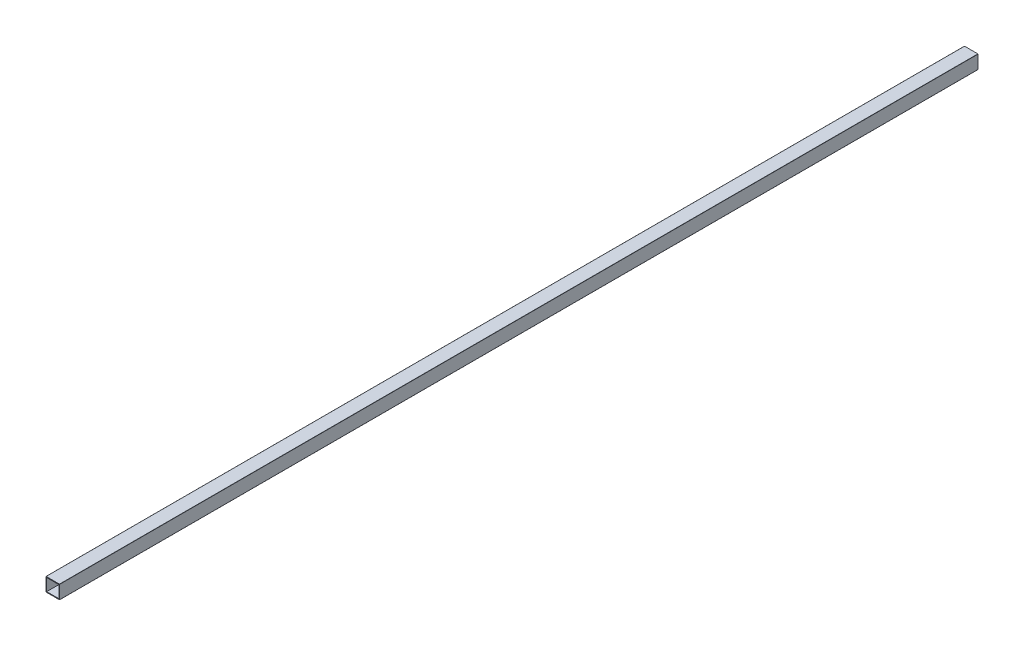
ISO-10303-21;
HEADER;
FILE_DESCRIPTION(('STEP AP214'),'2;1');
FILE_NAME('part.step','',(''),(''),'','','');
FILE_SCHEMA(('AUTOMOTIVE_DESIGN { 1 0 10303 214 1 1 1 1 }'));
ENDSEC;
DATA;
#1=APPLICATION_CONTEXT('core data for automotive mechanical design processes');
#2=APPLICATION_PROTOCOL_DEFINITION('international standard','automotive_design',2000,#1);
#3=PRODUCT_CONTEXT('',#1,'mechanical');
#4=PRODUCT('Part','Part','',(#3));
#5=PRODUCT_RELATED_PRODUCT_CATEGORY('part','',(#4));
#6=PRODUCT_DEFINITION_FORMATION('','',#4);
#7=PRODUCT_DEFINITION_CONTEXT('part definition',#1,'design');
#8=PRODUCT_DEFINITION('design','',#6,#7);
#9=PRODUCT_DEFINITION_SHAPE('','',#8);
#10=(LENGTH_UNIT() NAMED_UNIT(*) SI_UNIT(.MILLI.,.METRE.));
#11=(NAMED_UNIT(*) PLANE_ANGLE_UNIT() SI_UNIT($,.RADIAN.));
#12=(NAMED_UNIT(*) SI_UNIT($,.STERADIAN.) SOLID_ANGLE_UNIT());
#13=UNCERTAINTY_MEASURE_WITH_UNIT(LENGTH_MEASURE(1.E-05),#10,'distance_accuracy_value','');
#14=(GEOMETRIC_REPRESENTATION_CONTEXT(3) GLOBAL_UNCERTAINTY_ASSIGNED_CONTEXT((#13)) GLOBAL_UNIT_ASSIGNED_CONTEXT((#10,
#11,#12)) REPRESENTATION_CONTEXT('',''));
#15=CARTESIAN_POINT('',(0.,0.,0.));
#16=DIRECTION('',(0.,0.,1.));
#17=DIRECTION('',(1.,0.,0.));
#18=AXIS2_PLACEMENT_3D('',#15,#16,#17);
#19=CARTESIAN_POINT('',(43.45,43.45,6000.));
#20=DIRECTION('',(0.,0.,-1.));
#21=DIRECTION('',(-1.,0.,0.));
#22=AXIS2_PLACEMENT_3D('',#19,#20,#21);
#23=PLANE('',#22);
#24=CARTESIAN_POINT('',(43.45,43.45,6000.));
#25=DIRECTION('',(0.,0.,1.));
#26=DIRECTION('',(-1.,0.,0.));
#27=AXIS2_PLACEMENT_3D('',#24,#25,#26);
#28=CIRCLE('',#27,1.);
#29=CARTESIAN_POINT('',(44.45,43.45,6000.));
#30=VERTEX_POINT('',#29);
#31=CARTESIAN_POINT('',(43.45,44.45,6000.));
#32=VERTEX_POINT('',#31);
#33=EDGE_CURVE('E158',#30,#32,#28,.T.);
#34=ORIENTED_EDGE('',*,*,#33,.T.);
#35=DIRECTION('',(-1.,0.,0.));
#36=VECTOR('',#35,1.);
#37=CARTESIAN_POINT('',(-43.45,44.45,6000.));
#38=LINE('',#37,#36);
#39=CARTESIAN_POINT('',(-43.45,44.45,6000.));
#40=VERTEX_POINT('',#39);
#41=EDGE_CURVE('E161',#32,#40,#38,.T.);
#42=ORIENTED_EDGE('',*,*,#41,.T.);
#43=CARTESIAN_POINT('',(-43.45,43.45,6000.));
#44=DIRECTION('',(0.,0.,1.));
#45=DIRECTION('',(-1.,0.,0.));
#46=AXIS2_PLACEMENT_3D('',#43,#44,#45);
#47=CIRCLE('',#46,1.);
#48=CARTESIAN_POINT('',(-44.45,43.45,6000.));
#49=VERTEX_POINT('',#48);
#50=EDGE_CURVE('E164',#40,#49,#47,.T.);
#51=ORIENTED_EDGE('',*,*,#50,.T.);
#52=DIRECTION('',(0.,-1.,0.));
#53=VECTOR('',#52,1.);
#54=CARTESIAN_POINT('',(-44.45,-43.45,6000.));
#55=LINE('',#54,#53);
#56=CARTESIAN_POINT('',(-44.45,-43.45,6000.));
#57=VERTEX_POINT('',#56);
#58=EDGE_CURVE('E166',#49,#57,#55,.T.);
#59=ORIENTED_EDGE('',*,*,#58,.T.);
#60=CARTESIAN_POINT('',(-43.45,-43.45,6000.));
#61=DIRECTION('',(0.,0.,1.));
#62=DIRECTION('',(-1.,0.,0.));
#63=AXIS2_PLACEMENT_3D('',#60,#61,#62);
#64=CIRCLE('',#63,1.);
#65=CARTESIAN_POINT('',(-43.45,-44.45,6000.));
#66=VERTEX_POINT('',#65);
#67=EDGE_CURVE('E168',#57,#66,#64,.T.);
#68=ORIENTED_EDGE('',*,*,#67,.T.);
#69=DIRECTION('',(1.,0.,0.));
#70=VECTOR('',#69,1.);
#71=CARTESIAN_POINT('',(-43.45,-44.45,6000.));
#72=LINE('',#71,#70);
#73=CARTESIAN_POINT('',(43.45,-44.45,6000.));
#74=VERTEX_POINT('',#73);
#75=EDGE_CURVE('E170',#66,#74,#72,.T.);
#76=ORIENTED_EDGE('',*,*,#75,.T.);
#77=CARTESIAN_POINT('',(43.45,-43.45,6000.));
#78=DIRECTION('',(0.,0.,1.));
#79=DIRECTION('',(1.,0.,0.));
#80=AXIS2_PLACEMENT_3D('',#77,#78,#79);
#81=CIRCLE('',#80,1.);
#82=CARTESIAN_POINT('',(44.45,-43.45,6000.));
#83=VERTEX_POINT('',#82);
#84=EDGE_CURVE('E172',#74,#83,#81,.T.);
#85=ORIENTED_EDGE('',*,*,#84,.T.);
#86=DIRECTION('',(0.,1.,0.));
#87=VECTOR('',#86,1.);
#88=CARTESIAN_POINT('',(44.45,-43.45,6000.));
#89=LINE('',#88,#87);
#90=EDGE_CURVE('E174',#83,#30,#89,.T.);
#91=ORIENTED_EDGE('',*,*,#90,.T.);
#92=EDGE_LOOP('',(#34,#42,#51,#59,#68,#76,#85,#91));
#93=FACE_BOUND('',#92,.T.);
#94=DIRECTION('',(1.,0.,0.));
#95=VECTOR('',#94,1.);
#96=CARTESIAN_POINT('',(-39.9,-39.9,6000.));
#97=LINE('',#96,#95);
#98=CARTESIAN_POINT('',(-39.9,-39.9,6000.));
#99=VERTEX_POINT('',#98);
#100=CARTESIAN_POINT('',(39.9,-39.9,6000.));
#101=VERTEX_POINT('',#100);
#102=EDGE_CURVE('E122',#99,#101,#97,.T.);
#103=ORIENTED_EDGE('',*,*,#102,.F.);
#104=DIRECTION('',(0.,-1.,0.));
#105=VECTOR('',#104,1.);
#106=CARTESIAN_POINT('',(-39.9,-39.9,6000.));
#107=LINE('',#106,#105);
#108=CARTESIAN_POINT('',(-39.9,39.9,6000.));
#109=VERTEX_POINT('',#108);
#110=EDGE_CURVE('E144',#109,#99,#107,.T.);
#111=ORIENTED_EDGE('',*,*,#110,.F.);
#112=DIRECTION('',(-1.,0.,0.));
#113=VECTOR('',#112,1.);
#114=CARTESIAN_POINT('',(-39.9,39.9,6000.));
#115=LINE('',#114,#113);
#116=CARTESIAN_POINT('',(39.9,39.9,6000.));
#117=VERTEX_POINT('',#116);
#118=EDGE_CURVE('E142',#117,#109,#115,.T.);
#119=ORIENTED_EDGE('',*,*,#118,.F.);
#120=DIRECTION('',(0.,1.,0.));
#121=VECTOR('',#120,1.);
#122=CARTESIAN_POINT('',(39.9,-39.9,6000.));
#123=LINE('',#122,#121);
#124=EDGE_CURVE('E130',#101,#117,#123,.T.);
#125=ORIENTED_EDGE('',*,*,#124,.F.);
#126=EDGE_LOOP('',(#103,#111,#119,#125));
#127=FACE_BOUND('',#126,.T.);
#128=ADVANCED_FACE('F33',(#93,#127),#23,.F.);
#129=CARTESIAN_POINT('',(43.45,43.45,0.));
#130=DIRECTION('',(0.,0.,-1.));
#131=DIRECTION('',(-1.,0.,0.));
#132=AXIS2_PLACEMENT_3D('',#129,#130,#131);
#133=PLANE('',#132);
#134=CARTESIAN_POINT('',(43.45,43.45,0.));
#135=DIRECTION('',(0.,0.,1.));
#136=DIRECTION('',(-1.,0.,0.));
#137=AXIS2_PLACEMENT_3D('',#134,#135,#136);
#138=CIRCLE('',#137,1.);
#139=CARTESIAN_POINT('',(44.45,43.45,0.));
#140=VERTEX_POINT('',#139);
#141=CARTESIAN_POINT('',(43.45,44.45,0.));
#142=VERTEX_POINT('',#141);
#143=EDGE_CURVE('E138',#140,#142,#138,.T.);
#144=ORIENTED_EDGE('',*,*,#143,.F.);
#145=DIRECTION('',(0.,1.,0.));
#146=VECTOR('',#145,1.);
#147=CARTESIAN_POINT('',(44.45,-43.45,0.));
#148=LINE('',#147,#146);
#149=CARTESIAN_POINT('',(44.45,-43.45,0.));
#150=VERTEX_POINT('',#149);
#151=EDGE_CURVE('E162',#150,#140,#148,.T.);
#152=ORIENTED_EDGE('',*,*,#151,.F.);
#153=CARTESIAN_POINT('',(43.45,-43.45,0.));
#154=DIRECTION('',(0.,0.,1.));
#155=DIRECTION('',(1.,0.,0.));
#156=AXIS2_PLACEMENT_3D('',#153,#154,#155);
#157=CIRCLE('',#156,1.);
#158=CARTESIAN_POINT('',(43.45,-44.45,0.));
#159=VERTEX_POINT('',#158);
#160=EDGE_CURVE('E189',#159,#150,#157,.T.);
#161=ORIENTED_EDGE('',*,*,#160,.F.);
#162=DIRECTION('',(1.,0.,0.));
#163=VECTOR('',#162,1.);
#164=CARTESIAN_POINT('',(-43.45,-44.45,0.));
#165=LINE('',#164,#163);
#166=CARTESIAN_POINT('',(-43.45,-44.45,0.));
#167=VERTEX_POINT('',#166);
#168=EDGE_CURVE('E187',#167,#159,#165,.T.);
#169=ORIENTED_EDGE('',*,*,#168,.F.);
#170=CARTESIAN_POINT('',(-43.45,-43.45,0.));
#171=DIRECTION('',(0.,0.,1.));
#172=DIRECTION('',(-1.,0.,0.));
#173=AXIS2_PLACEMENT_3D('',#170,#171,#172);
#174=CIRCLE('',#173,1.);
#175=CARTESIAN_POINT('',(-44.45,-43.45,0.));
#176=VERTEX_POINT('',#175);
#177=EDGE_CURVE('E185',#176,#167,#174,.T.);
#178=ORIENTED_EDGE('',*,*,#177,.F.);
#179=DIRECTION('',(0.,-1.,0.));
#180=VECTOR('',#179,1.);
#181=CARTESIAN_POINT('',(-44.45,-43.45,0.));
#182=LINE('',#181,#180);
#183=CARTESIAN_POINT('',(-44.45,43.45,0.));
#184=VERTEX_POINT('',#183);
#185=EDGE_CURVE('E183',#184,#176,#182,.T.);
#186=ORIENTED_EDGE('',*,*,#185,.F.);
#187=CARTESIAN_POINT('',(-43.45,43.45,0.));
#188=DIRECTION('',(0.,0.,1.));
#189=DIRECTION('',(-1.,0.,0.));
#190=AXIS2_PLACEMENT_3D('',#187,#188,#189);
#191=CIRCLE('',#190,1.);
#192=CARTESIAN_POINT('',(-43.45,44.45,0.));
#193=VERTEX_POINT('',#192);
#194=EDGE_CURVE('E181',#193,#184,#191,.T.);
#195=ORIENTED_EDGE('',*,*,#194,.F.);
#196=DIRECTION('',(-1.,0.,0.));
#197=VECTOR('',#196,1.);
#198=CARTESIAN_POINT('',(-43.45,44.45,0.));
#199=LINE('',#198,#197);
#200=EDGE_CURVE('E179',#142,#193,#199,.T.);
#201=ORIENTED_EDGE('',*,*,#200,.F.);
#202=EDGE_LOOP('',(#144,#152,#161,#169,#178,#186,#195,#201));
#203=FACE_BOUND('',#202,.T.);
#204=DIRECTION('',(0.,-1.,0.));
#205=VECTOR('',#204,1.);
#206=CARTESIAN_POINT('',(-39.9,-39.9,0.));
#207=LINE('',#206,#205);
#208=CARTESIAN_POINT('',(-39.9,39.9,0.));
#209=VERTEX_POINT('',#208);
#210=CARTESIAN_POINT('',(-39.9,-39.9,0.));
#211=VERTEX_POINT('',#210);
#212=EDGE_CURVE('E131',#209,#211,#207,.T.);
#213=ORIENTED_EDGE('',*,*,#212,.T.);
#214=DIRECTION('',(1.,0.,0.));
#215=VECTOR('',#214,1.);
#216=CARTESIAN_POINT('',(-39.9,-39.9,0.));
#217=LINE('',#216,#215);
#218=CARTESIAN_POINT('',(39.9,-39.9,0.));
#219=VERTEX_POINT('',#218);
#220=EDGE_CURVE('E56',#211,#219,#217,.T.);
#221=ORIENTED_EDGE('',*,*,#220,.T.);
#222=DIRECTION('',(0.,1.,0.));
#223=VECTOR('',#222,1.);
#224=CARTESIAN_POINT('',(39.9,-39.9,0.));
#225=LINE('',#224,#223);
#226=CARTESIAN_POINT('',(39.9,39.9,0.));
#227=VERTEX_POINT('',#226);
#228=EDGE_CURVE('E137',#219,#227,#225,.T.);
#229=ORIENTED_EDGE('',*,*,#228,.T.);
#230=DIRECTION('',(-1.,0.,0.));
#231=VECTOR('',#230,1.);
#232=CARTESIAN_POINT('',(-39.9,39.9,0.));
#233=LINE('',#232,#231);
#234=EDGE_CURVE('E150',#227,#209,#233,.T.);
#235=ORIENTED_EDGE('',*,*,#234,.T.);
#236=EDGE_LOOP('',(#213,#221,#229,#235));
#237=FACE_BOUND('',#236,.T.);
#238=ADVANCED_FACE('F219',(#203,#237),#133,.T.);
#239=CARTESIAN_POINT('',(43.45,43.45,6000.));
#240=DIRECTION('',(0.,0.,-1.));
#241=DIRECTION('',(-1.,0.,0.));
#242=AXIS2_PLACEMENT_3D('',#239,#240,#241);
#243=CYLINDRICAL_SURFACE('',#242,1.);
#244=ORIENTED_EDGE('',*,*,#143,.T.);
#245=DIRECTION('',(0.,0.,-1.));
#246=VECTOR('',#245,1.);
#247=CARTESIAN_POINT('',(43.45,44.45,6000.));
#248=LINE('',#247,#246);
#249=EDGE_CURVE('E11',#32,#142,#248,.T.);
#250=ORIENTED_EDGE('',*,*,#249,.F.);
#251=ORIENTED_EDGE('',*,*,#33,.F.);
#252=DIRECTION('',(0.,0.,-1.));
#253=VECTOR('',#252,1.);
#254=CARTESIAN_POINT('',(44.45,43.45,6000.));
#255=LINE('',#254,#253);
#256=EDGE_CURVE('E176',#30,#140,#255,.T.);
#257=ORIENTED_EDGE('',*,*,#256,.T.);
#258=EDGE_LOOP('',(#244,#250,#251,#257));
#259=FACE_BOUND('',#258,.T.);
#260=ADVANCED_FACE('F35',(#259),#243,.T.);
#261=CARTESIAN_POINT('',(-43.45,44.45,6000.));
#262=DIRECTION('',(0.,-1.,0.));
#263=DIRECTION('',(0.,0.,-1.));
#264=AXIS2_PLACEMENT_3D('',#261,#262,#263);
#265=PLANE('',#264);
#266=ORIENTED_EDGE('',*,*,#200,.T.);
#267=DIRECTION('',(0.,0.,-1.));
#268=VECTOR('',#267,1.);
#269=CARTESIAN_POINT('',(-43.45,44.45,6000.));
#270=LINE('',#269,#268);
#271=EDGE_CURVE('E41',#40,#193,#270,.T.);
#272=ORIENTED_EDGE('',*,*,#271,.F.);
#273=ORIENTED_EDGE('',*,*,#41,.F.);
#274=ORIENTED_EDGE('',*,*,#249,.T.);
#275=EDGE_LOOP('',(#266,#272,#273,#274));
#276=FACE_BOUND('',#275,.T.);
#277=ADVANCED_FACE('F236',(#276),#265,.F.);
#278=CARTESIAN_POINT('',(-43.45,43.45,6000.));
#279=DIRECTION('',(0.,0.,-1.));
#280=DIRECTION('',(-1.,0.,0.));
#281=AXIS2_PLACEMENT_3D('',#278,#279,#280);
#282=CYLINDRICAL_SURFACE('',#281,1.);
#283=ORIENTED_EDGE('',*,*,#194,.T.);
#284=DIRECTION('',(0.,0.,-1.));
#285=VECTOR('',#284,1.);
#286=CARTESIAN_POINT('',(-44.45,43.45,6000.));
#287=LINE('',#286,#285);
#288=EDGE_CURVE('E206',#49,#184,#287,.T.);
#289=ORIENTED_EDGE('',*,*,#288,.F.);
#290=ORIENTED_EDGE('',*,*,#50,.F.);
#291=ORIENTED_EDGE('',*,*,#271,.T.);
#292=EDGE_LOOP('',(#283,#289,#290,#291));
#293=FACE_BOUND('',#292,.T.);
#294=ADVANCED_FACE('F213',(#293),#282,.T.);
#295=CARTESIAN_POINT('',(-44.45,-43.45,6000.));
#296=DIRECTION('',(1.,0.,0.));
#297=DIRECTION('',(0.,0.,-1.));
#298=AXIS2_PLACEMENT_3D('',#295,#296,#297);
#299=PLANE('',#298);
#300=ORIENTED_EDGE('',*,*,#185,.T.);
#301=DIRECTION('',(0.,0.,-1.));
#302=VECTOR('',#301,1.);
#303=CARTESIAN_POINT('',(-44.45,-43.45,6000.));
#304=LINE('',#303,#302);
#305=EDGE_CURVE('E203',#57,#176,#304,.T.);
#306=ORIENTED_EDGE('',*,*,#305,.F.);
#307=ORIENTED_EDGE('',*,*,#58,.F.);
#308=ORIENTED_EDGE('',*,*,#288,.T.);
#309=EDGE_LOOP('',(#300,#306,#307,#308));
#310=FACE_BOUND('',#309,.T.);
#311=ADVANCED_FACE('F225',(#310),#299,.F.);
#312=CARTESIAN_POINT('',(-43.45,-43.45,6000.));
#313=DIRECTION('',(0.,0.,-1.));
#314=DIRECTION('',(-1.,0.,0.));
#315=AXIS2_PLACEMENT_3D('',#312,#313,#314);
#316=CYLINDRICAL_SURFACE('',#315,1.);
#317=ORIENTED_EDGE('',*,*,#177,.T.);
#318=DIRECTION('',(0.,0.,-1.));
#319=VECTOR('',#318,1.);
#320=CARTESIAN_POINT('',(-43.45,-44.45,6000.));
#321=LINE('',#320,#319);
#322=EDGE_CURVE('E200',#66,#167,#321,.T.);
#323=ORIENTED_EDGE('',*,*,#322,.F.);
#324=ORIENTED_EDGE('',*,*,#67,.F.);
#325=ORIENTED_EDGE('',*,*,#305,.T.);
#326=EDGE_LOOP('',(#317,#323,#324,#325));
#327=FACE_BOUND('',#326,.T.);
#328=ADVANCED_FACE('F229',(#327),#316,.T.);
#329=CARTESIAN_POINT('',(-43.45,-44.45,6000.));
#330=DIRECTION('',(0.,1.,0.));
#331=DIRECTION('',(0.,0.,1.));
#332=AXIS2_PLACEMENT_3D('',#329,#330,#331);
#333=PLANE('',#332);
#334=ORIENTED_EDGE('',*,*,#168,.T.);
#335=DIRECTION('',(0.,0.,-1.));
#336=VECTOR('',#335,1.);
#337=CARTESIAN_POINT('',(43.45,-44.45,6000.));
#338=LINE('',#337,#336);
#339=EDGE_CURVE('E197',#74,#159,#338,.T.);
#340=ORIENTED_EDGE('',*,*,#339,.F.);
#341=ORIENTED_EDGE('',*,*,#75,.F.);
#342=ORIENTED_EDGE('',*,*,#322,.T.);
#343=EDGE_LOOP('',(#334,#340,#341,#342));
#344=FACE_BOUND('',#343,.T.);
#345=ADVANCED_FACE('F249',(#344),#333,.F.);
#346=CARTESIAN_POINT('',(43.45,-43.45,6000.));
#347=DIRECTION('',(0.,0.,-1.));
#348=DIRECTION('',(-1.,0.,0.));
#349=AXIS2_PLACEMENT_3D('',#346,#347,#348);
#350=CYLINDRICAL_SURFACE('',#349,1.);
#351=ORIENTED_EDGE('',*,*,#160,.T.);
#352=DIRECTION('',(0.,0.,-1.));
#353=VECTOR('',#352,1.);
#354=CARTESIAN_POINT('',(44.45,-43.45,6000.));
#355=LINE('',#354,#353);
#356=EDGE_CURVE('E194',#83,#150,#355,.T.);
#357=ORIENTED_EDGE('',*,*,#356,.F.);
#358=ORIENTED_EDGE('',*,*,#84,.F.);
#359=ORIENTED_EDGE('',*,*,#339,.T.);
#360=EDGE_LOOP('',(#351,#357,#358,#359));
#361=FACE_BOUND('',#360,.T.);
#362=ADVANCED_FACE('F247',(#361),#350,.T.);
#363=CARTESIAN_POINT('',(44.45,-43.45,6000.));
#364=DIRECTION('',(-1.,0.,0.));
#365=DIRECTION('',(0.,0.,1.));
#366=AXIS2_PLACEMENT_3D('',#363,#364,#365);
#367=PLANE('',#366);
#368=ORIENTED_EDGE('',*,*,#151,.T.);
#369=ORIENTED_EDGE('',*,*,#256,.F.);
#370=ORIENTED_EDGE('',*,*,#90,.F.);
#371=ORIENTED_EDGE('',*,*,#356,.T.);
#372=EDGE_LOOP('',(#368,#369,#370,#371));
#373=FACE_BOUND('',#372,.T.);
#374=ADVANCED_FACE('F242',(#373),#367,.F.);
#375=CARTESIAN_POINT('',(-39.9,-39.9,6000.));
#376=DIRECTION('',(0.,1.,0.));
#377=DIRECTION('',(0.,0.,1.));
#378=AXIS2_PLACEMENT_3D('',#375,#376,#377);
#379=PLANE('',#378);
#380=ORIENTED_EDGE('',*,*,#220,.F.);
#381=DIRECTION('',(0.,0.,-1.));
#382=VECTOR('',#381,1.);
#383=CARTESIAN_POINT('',(-39.9,-39.9,6000.));
#384=LINE('',#383,#382);
#385=EDGE_CURVE('E126',#99,#211,#384,.T.);
#386=ORIENTED_EDGE('',*,*,#385,.F.);
#387=ORIENTED_EDGE('',*,*,#102,.T.);
#388=DIRECTION('',(0.,0.,-1.));
#389=VECTOR('',#388,1.);
#390=CARTESIAN_POINT('',(39.9,-39.9,6000.));
#391=LINE('',#390,#389);
#392=EDGE_CURVE('E125',#101,#219,#391,.T.);
#393=ORIENTED_EDGE('',*,*,#392,.T.);
#394=EDGE_LOOP('',(#380,#386,#387,#393));
#395=FACE_BOUND('',#394,.T.);
#396=ADVANCED_FACE('F124',(#395),#379,.T.);
#397=CARTESIAN_POINT('',(39.9,-39.9,6000.));
#398=DIRECTION('',(-1.,0.,0.));
#399=DIRECTION('',(0.,0.,1.));
#400=AXIS2_PLACEMENT_3D('',#397,#398,#399);
#401=PLANE('',#400);
#402=ORIENTED_EDGE('',*,*,#228,.F.);
#403=ORIENTED_EDGE('',*,*,#392,.F.);
#404=ORIENTED_EDGE('',*,*,#124,.T.);
#405=DIRECTION('',(0.,0.,-1.));
#406=VECTOR('',#405,1.);
#407=CARTESIAN_POINT('',(39.9,39.9,6000.));
#408=LINE('',#407,#406);
#409=EDGE_CURVE('E139',#117,#227,#408,.T.);
#410=ORIENTED_EDGE('',*,*,#409,.T.);
#411=EDGE_LOOP('',(#402,#403,#404,#410));
#412=FACE_BOUND('',#411,.T.);
#413=ADVANCED_FACE('F134',(#412),#401,.T.);
#414=CARTESIAN_POINT('',(-39.9,39.9,6000.));
#415=DIRECTION('',(0.,-1.,0.));
#416=DIRECTION('',(0.,0.,-1.));
#417=AXIS2_PLACEMENT_3D('',#414,#415,#416);
#418=PLANE('',#417);
#419=ORIENTED_EDGE('',*,*,#234,.F.);
#420=ORIENTED_EDGE('',*,*,#409,.F.);
#421=ORIENTED_EDGE('',*,*,#118,.T.);
#422=DIRECTION('',(0.,0.,-1.));
#423=VECTOR('',#422,1.);
#424=CARTESIAN_POINT('',(-39.9,39.9,6000.));
#425=LINE('',#424,#423);
#426=EDGE_CURVE('E48',#109,#209,#425,.T.);
#427=ORIENTED_EDGE('',*,*,#426,.T.);
#428=EDGE_LOOP('',(#419,#420,#421,#427));
#429=FACE_BOUND('',#428,.T.);
#430=ADVANCED_FACE('F274',(#429),#418,.T.);
#431=CARTESIAN_POINT('',(-39.9,-39.9,6000.));
#432=DIRECTION('',(1.,0.,0.));
#433=DIRECTION('',(0.,0.,-1.));
#434=AXIS2_PLACEMENT_3D('',#431,#432,#433);
#435=PLANE('',#434);
#436=ORIENTED_EDGE('',*,*,#212,.F.);
#437=ORIENTED_EDGE('',*,*,#426,.F.);
#438=ORIENTED_EDGE('',*,*,#110,.T.);
#439=ORIENTED_EDGE('',*,*,#385,.T.);
#440=EDGE_LOOP('',(#436,#437,#438,#439));
#441=FACE_BOUND('',#440,.T.);
#442=ADVANCED_FACE('F278',(#441),#435,.T.);
#443=CLOSED_SHELL('',(#128,#238,#260,#277,#294,#311,#328,#345,#362,#374,#396,#413,#430,#442));
#444=MANIFOLD_SOLID_BREP('B2',#443);
#445=ADVANCED_BREP_SHAPE_REPRESENTATION('',(#18,#444),#14);
#446=SHAPE_DEFINITION_REPRESENTATION(#9,#445);
ENDSEC;
END-ISO-10303-21;
